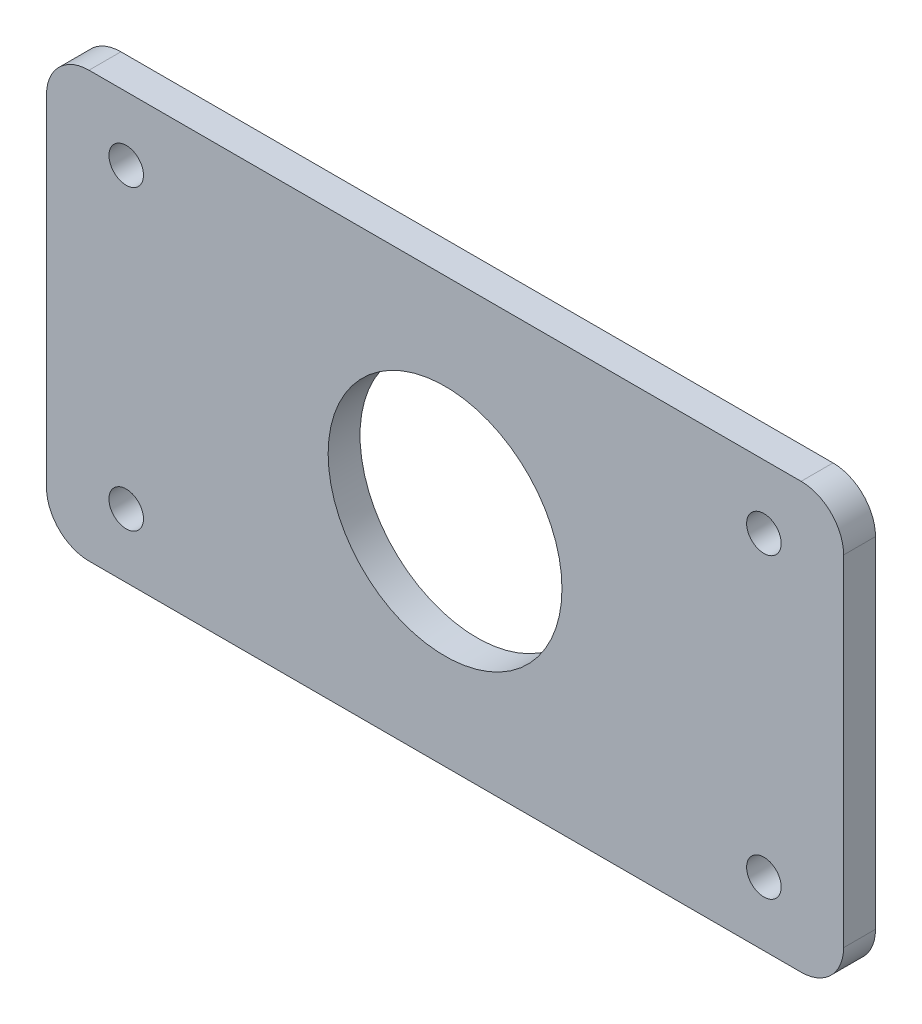
ISO-10303-21;
HEADER;
FILE_DESCRIPTION(('STEP AP214'),'2;1');
FILE_NAME('part.step','',(''),(''),'','','');
FILE_SCHEMA(('AUTOMOTIVE_DESIGN { 1 0 10303 214 1 1 1 1 }'));
ENDSEC;
DATA;
#1=APPLICATION_CONTEXT('core data for automotive mechanical design processes');
#2=APPLICATION_PROTOCOL_DEFINITION('international standard','automotive_design',2000,#1);
#3=PRODUCT_CONTEXT('',#1,'mechanical');
#4=PRODUCT('Part','Part','',(#3));
#5=PRODUCT_RELATED_PRODUCT_CATEGORY('part','',(#4));
#6=PRODUCT_DEFINITION_FORMATION('','',#4);
#7=PRODUCT_DEFINITION_CONTEXT('part definition',#1,'design');
#8=PRODUCT_DEFINITION('design','',#6,#7);
#9=PRODUCT_DEFINITION_SHAPE('','',#8);
#10=(LENGTH_UNIT() NAMED_UNIT(*) SI_UNIT(.MILLI.,.METRE.));
#11=(NAMED_UNIT(*) PLANE_ANGLE_UNIT() SI_UNIT($,.RADIAN.));
#12=(NAMED_UNIT(*) SI_UNIT($,.STERADIAN.) SOLID_ANGLE_UNIT());
#13=UNCERTAINTY_MEASURE_WITH_UNIT(LENGTH_MEASURE(1.E-05),#10,'distance_accuracy_value','');
#14=(GEOMETRIC_REPRESENTATION_CONTEXT(3) GLOBAL_UNCERTAINTY_ASSIGNED_CONTEXT((#13)) GLOBAL_UNIT_ASSIGNED_CONTEXT((#10,
#11,#12)) REPRESENTATION_CONTEXT('',''));
#15=CARTESIAN_POINT('',(0.,0.,0.));
#16=DIRECTION('',(0.,0.,1.));
#17=DIRECTION('',(1.,0.,0.));
#18=AXIS2_PLACEMENT_3D('',#15,#16,#17);
#19=CARTESIAN_POINT('',(75.,-40.,3.));
#20=DIRECTION('',(-1.,0.,0.));
#21=DIRECTION('',(0.,0.,1.));
#22=AXIS2_PLACEMENT_3D('',#19,#20,#21);
#23=PLANE('',#22);
#24=DIRECTION('',(0.,1.,0.));
#25=VECTOR('',#24,1.);
#26=CARTESIAN_POINT('',(75.,-40.,-3.));
#27=LINE('',#26,#25);
#28=CARTESIAN_POINT('',(75.,-32.,-3.));
#29=VERTEX_POINT('',#28);
#30=CARTESIAN_POINT('',(75.,32.,-3.));
#31=VERTEX_POINT('',#30);
#32=EDGE_CURVE('E129',#29,#31,#27,.T.);
#33=ORIENTED_EDGE('',*,*,#32,.T.);
#34=DIRECTION('',(0.,0.,-1.));
#35=VECTOR('',#34,1.);
#36=CARTESIAN_POINT('',(75.,32.,3.));
#37=LINE('',#36,#35);
#38=CARTESIAN_POINT('',(75.,32.,3.));
#39=VERTEX_POINT('',#38);
#40=EDGE_CURVE('E107',#31,#39,#37,.F.);
#41=ORIENTED_EDGE('',*,*,#40,.T.);
#42=DIRECTION('',(0.,1.,0.));
#43=VECTOR('',#42,1.);
#44=CARTESIAN_POINT('',(75.,-40.,3.));
#45=LINE('',#44,#43);
#46=CARTESIAN_POINT('',(75.,-32.,3.));
#47=VERTEX_POINT('',#46);
#48=EDGE_CURVE('E139',#47,#39,#45,.T.);
#49=ORIENTED_EDGE('',*,*,#48,.F.);
#50=DIRECTION('',(0.,0.,-1.));
#51=VECTOR('',#50,1.);
#52=CARTESIAN_POINT('',(75.,-32.,3.));
#53=LINE('',#52,#51);
#54=EDGE_CURVE('E112',#47,#29,#53,.T.);
#55=ORIENTED_EDGE('',*,*,#54,.T.);
#56=EDGE_LOOP('',(#33,#41,#49,#55));
#57=FACE_BOUND('',#56,.T.);
#58=ADVANCED_FACE('F36',(#57),#23,.F.);
#59=CARTESIAN_POINT('',(-75.,40.,3.));
#60=DIRECTION('',(0.,-1.,0.));
#61=DIRECTION('',(0.,0.,-1.));
#62=AXIS2_PLACEMENT_3D('',#59,#60,#61);
#63=PLANE('',#62);
#64=DIRECTION('',(-1.,0.,0.));
#65=VECTOR('',#64,1.);
#66=CARTESIAN_POINT('',(-75.,40.,3.));
#67=LINE('',#66,#65);
#68=CARTESIAN_POINT('',(67.,40.,3.));
#69=VERTEX_POINT('',#68);
#70=CARTESIAN_POINT('',(-67.,40.,3.));
#71=VERTEX_POINT('',#70);
#72=EDGE_CURVE('E122',#69,#71,#67,.T.);
#73=ORIENTED_EDGE('',*,*,#72,.F.);
#74=DIRECTION('',(0.,0.,-1.));
#75=VECTOR('',#74,1.);
#76=CARTESIAN_POINT('',(67.,40.,3.));
#77=LINE('',#76,#75);
#78=CARTESIAN_POINT('',(67.,40.,-3.));
#79=VERTEX_POINT('',#78);
#80=EDGE_CURVE('E106',#69,#79,#77,.T.);
#81=ORIENTED_EDGE('',*,*,#80,.T.);
#82=DIRECTION('',(-1.,0.,0.));
#83=VECTOR('',#82,1.);
#84=CARTESIAN_POINT('',(-75.,40.,-3.));
#85=LINE('',#84,#83);
#86=CARTESIAN_POINT('',(-67.,40.,-3.));
#87=VERTEX_POINT('',#86);
#88=EDGE_CURVE('E119',#79,#87,#85,.T.);
#89=ORIENTED_EDGE('',*,*,#88,.T.);
#90=DIRECTION('',(0.,0.,-1.));
#91=VECTOR('',#90,1.);
#92=CARTESIAN_POINT('',(-67.,40.,3.));
#93=LINE('',#92,#91);
#94=EDGE_CURVE('E124',#87,#71,#93,.F.);
#95=ORIENTED_EDGE('',*,*,#94,.T.);
#96=EDGE_LOOP('',(#73,#81,#89,#95));
#97=FACE_BOUND('',#96,.T.);
#98=ADVANCED_FACE('F118',(#97),#63,.F.);
#99=CARTESIAN_POINT('',(-75.,-40.,3.));
#100=DIRECTION('',(1.,0.,0.));
#101=DIRECTION('',(0.,0.,-1.));
#102=AXIS2_PLACEMENT_3D('',#99,#100,#101);
#103=PLANE('',#102);
#104=DIRECTION('',(0.,-1.,0.));
#105=VECTOR('',#104,1.);
#106=CARTESIAN_POINT('',(-75.,-40.,-3.));
#107=LINE('',#106,#105);
#108=CARTESIAN_POINT('',(-75.,32.,-3.));
#109=VERTEX_POINT('',#108);
#110=CARTESIAN_POINT('',(-75.,-32.,-3.));
#111=VERTEX_POINT('',#110);
#112=EDGE_CURVE('E128',#109,#111,#107,.T.);
#113=ORIENTED_EDGE('',*,*,#112,.T.);
#114=DIRECTION('',(0.,0.,-1.));
#115=VECTOR('',#114,1.);
#116=CARTESIAN_POINT('',(-75.,-32.,3.));
#117=LINE('',#116,#115);
#118=CARTESIAN_POINT('',(-75.,-32.,3.));
#119=VERTEX_POINT('',#118);
#120=EDGE_CURVE('E11',#111,#119,#117,.F.);
#121=ORIENTED_EDGE('',*,*,#120,.T.);
#122=DIRECTION('',(0.,-1.,0.));
#123=VECTOR('',#122,1.);
#124=CARTESIAN_POINT('',(-75.,-40.,3.));
#125=LINE('',#124,#123);
#126=CARTESIAN_POINT('',(-75.,32.,3.));
#127=VERTEX_POINT('',#126);
#128=EDGE_CURVE('E165',#127,#119,#125,.T.);
#129=ORIENTED_EDGE('',*,*,#128,.F.);
#130=DIRECTION('',(0.,0.,-1.));
#131=VECTOR('',#130,1.);
#132=CARTESIAN_POINT('',(-75.,32.,3.));
#133=LINE('',#132,#131);
#134=EDGE_CURVE('E44',#127,#109,#133,.T.);
#135=ORIENTED_EDGE('',*,*,#134,.T.);
#136=EDGE_LOOP('',(#113,#121,#129,#135));
#137=FACE_BOUND('',#136,.T.);
#138=ADVANCED_FACE('F163',(#137),#103,.F.);
#139=CARTESIAN_POINT('',(-75.,-40.,3.));
#140=DIRECTION('',(0.,1.,0.));
#141=DIRECTION('',(0.,0.,1.));
#142=AXIS2_PLACEMENT_3D('',#139,#140,#141);
#143=PLANE('',#142);
#144=DIRECTION('',(1.,0.,0.));
#145=VECTOR('',#144,1.);
#146=CARTESIAN_POINT('',(-75.,-40.,-3.));
#147=LINE('',#146,#145);
#148=CARTESIAN_POINT('',(-67.,-40.,-3.));
#149=VERTEX_POINT('',#148);
#150=CARTESIAN_POINT('',(67.,-40.,-3.));
#151=VERTEX_POINT('',#150);
#152=EDGE_CURVE('E132',#149,#151,#147,.T.);
#153=ORIENTED_EDGE('',*,*,#152,.T.);
#154=DIRECTION('',(0.,0.,-1.));
#155=VECTOR('',#154,1.);
#156=CARTESIAN_POINT('',(67.,-40.,3.));
#157=LINE('',#156,#155);
#158=CARTESIAN_POINT('',(67.,-40.,3.));
#159=VERTEX_POINT('',#158);
#160=EDGE_CURVE('E51',#151,#159,#157,.F.);
#161=ORIENTED_EDGE('',*,*,#160,.T.);
#162=DIRECTION('',(1.,0.,0.));
#163=VECTOR('',#162,1.);
#164=CARTESIAN_POINT('',(-75.,-40.,3.));
#165=LINE('',#164,#163);
#166=CARTESIAN_POINT('',(-67.,-40.,3.));
#167=VERTEX_POINT('',#166);
#168=EDGE_CURVE('E140',#167,#159,#165,.T.);
#169=ORIENTED_EDGE('',*,*,#168,.F.);
#170=DIRECTION('',(0.,0.,-1.));
#171=VECTOR('',#170,1.);
#172=CARTESIAN_POINT('',(-67.,-40.,3.));
#173=LINE('',#172,#171);
#174=EDGE_CURVE('E156',#167,#149,#173,.T.);
#175=ORIENTED_EDGE('',*,*,#174,.T.);
#176=EDGE_LOOP('',(#153,#161,#169,#175));
#177=FACE_BOUND('',#176,.T.);
#178=ADVANCED_FACE('F172',(#177),#143,.F.);
#179=CARTESIAN_POINT('',(0.,0.,3.));
#180=DIRECTION('',(0.,0.,-1.));
#181=DIRECTION('',(-1.,0.,0.));
#182=AXIS2_PLACEMENT_3D('',#179,#180,#181);
#183=PLANE('',#182);
#184=CARTESIAN_POINT('',(60.,28.,3.));
#185=DIRECTION('',(0.,0.,-1.));
#186=DIRECTION('',(-1.,0.,0.));
#187=AXIS2_PLACEMENT_3D('',#184,#185,#186);
#188=CIRCLE('',#187,3.25000000000001);
#189=CARTESIAN_POINT('',(56.75,28.,3.));
#190=VERTEX_POINT('',#189);
#191=EDGE_CURVE('E134',#190,#190,#188,.T.);
#192=ORIENTED_EDGE('',*,*,#191,.T.);
#193=EDGE_LOOP('',(#192));
#194=FACE_BOUND('',#193,.T.);
#195=CARTESIAN_POINT('',(60.,-28.,3.));
#196=DIRECTION('',(0.,0.,-1.));
#197=DIRECTION('',(-1.,0.,0.));
#198=AXIS2_PLACEMENT_3D('',#195,#196,#197);
#199=CIRCLE('',#198,3.25000000000001);
#200=CARTESIAN_POINT('',(56.75,-28.,3.));
#201=VERTEX_POINT('',#200);
#202=EDGE_CURVE('E181',#201,#201,#199,.T.);
#203=ORIENTED_EDGE('',*,*,#202,.T.);
#204=EDGE_LOOP('',(#203));
#205=FACE_BOUND('',#204,.T.);
#206=CARTESIAN_POINT('',(-60.,-28.,3.));
#207=DIRECTION('',(0.,0.,-1.));
#208=DIRECTION('',(-1.,0.,0.));
#209=AXIS2_PLACEMENT_3D('',#206,#207,#208);
#210=CIRCLE('',#209,3.25);
#211=CARTESIAN_POINT('',(-63.25,-28.,3.));
#212=VERTEX_POINT('',#211);
#213=EDGE_CURVE('E184',#212,#212,#210,.T.);
#214=ORIENTED_EDGE('',*,*,#213,.T.);
#215=EDGE_LOOP('',(#214));
#216=FACE_BOUND('',#215,.T.);
#217=CARTESIAN_POINT('',(-60.,28.,3.));
#218=DIRECTION('',(0.,0.,-1.));
#219=DIRECTION('',(-1.,0.,0.));
#220=AXIS2_PLACEMENT_3D('',#217,#218,#219);
#221=CIRCLE('',#220,3.25);
#222=CARTESIAN_POINT('',(-63.25,28.,3.));
#223=VERTEX_POINT('',#222);
#224=EDGE_CURVE('E187',#223,#223,#221,.T.);
#225=ORIENTED_EDGE('',*,*,#224,.T.);
#226=EDGE_LOOP('',(#225));
#227=FACE_BOUND('',#226,.T.);
#228=CARTESIAN_POINT('',(0.,0.,3.));
#229=DIRECTION('',(0.,0.,-1.));
#230=DIRECTION('',(-1.,0.,0.));
#231=AXIS2_PLACEMENT_3D('',#228,#229,#230);
#232=CIRCLE('',#231,22.);
#233=CARTESIAN_POINT('',(-22.,0.,3.));
#234=VERTEX_POINT('',#233);
#235=EDGE_CURVE('E190',#234,#234,#232,.T.);
#236=ORIENTED_EDGE('',*,*,#235,.T.);
#237=EDGE_LOOP('',(#236));
#238=FACE_BOUND('',#237,.T.);
#239=ORIENTED_EDGE('',*,*,#48,.T.);
#240=CARTESIAN_POINT('',(67.,32.,3.));
#241=DIRECTION('',(0.,0.,-1.));
#242=DIRECTION('',(-1.,0.,0.));
#243=AXIS2_PLACEMENT_3D('',#240,#241,#242);
#244=CIRCLE('',#243,8.);
#245=EDGE_CURVE('E154',#39,#69,#244,.F.);
#246=ORIENTED_EDGE('',*,*,#245,.T.);
#247=ORIENTED_EDGE('',*,*,#72,.T.);
#248=CARTESIAN_POINT('',(-67.,32.,3.));
#249=DIRECTION('',(0.,0.,-1.));
#250=DIRECTION('',(-1.,0.,0.));
#251=AXIS2_PLACEMENT_3D('',#248,#249,#250);
#252=CIRCLE('',#251,8.);
#253=EDGE_CURVE('E149',#71,#127,#252,.F.);
#254=ORIENTED_EDGE('',*,*,#253,.T.);
#255=ORIENTED_EDGE('',*,*,#128,.T.);
#256=CARTESIAN_POINT('',(-67.,-32.,3.));
#257=DIRECTION('',(0.,0.,-1.));
#258=DIRECTION('',(-1.,0.,0.));
#259=AXIS2_PLACEMENT_3D('',#256,#257,#258);
#260=CIRCLE('',#259,8.);
#261=EDGE_CURVE('E58',#119,#167,#260,.F.);
#262=ORIENTED_EDGE('',*,*,#261,.T.);
#263=ORIENTED_EDGE('',*,*,#168,.T.);
#264=CARTESIAN_POINT('',(67.,-32.,3.));
#265=DIRECTION('',(0.,0.,-1.));
#266=DIRECTION('',(-1.,0.,0.));
#267=AXIS2_PLACEMENT_3D('',#264,#265,#266);
#268=CIRCLE('',#267,8.);
#269=EDGE_CURVE('E152',#159,#47,#268,.F.);
#270=ORIENTED_EDGE('',*,*,#269,.T.);
#271=EDGE_LOOP('',(#239,#246,#247,#254,#255,#262,#263,#270));
#272=FACE_BOUND('',#271,.T.);
#273=ADVANCED_FACE('F219',(#194,#205,#216,#227,#238,#272),#183,.F.);
#274=CARTESIAN_POINT('',(0.,0.,-3.));
#275=DIRECTION('',(0.,0.,-1.));
#276=DIRECTION('',(-1.,0.,0.));
#277=AXIS2_PLACEMENT_3D('',#274,#275,#276);
#278=PLANE('',#277);
#279=CARTESIAN_POINT('',(60.,28.,-3.));
#280=DIRECTION('',(0.,0.,1.));
#281=DIRECTION('',(1.,0.,0.));
#282=AXIS2_PLACEMENT_3D('',#279,#280,#281);
#283=CIRCLE('',#282,3.25000000000001);
#284=CARTESIAN_POINT('',(63.25,28.,-3.));
#285=VERTEX_POINT('',#284);
#286=EDGE_CURVE('E197',#285,#285,#283,.T.);
#287=ORIENTED_EDGE('',*,*,#286,.T.);
#288=EDGE_LOOP('',(#287));
#289=FACE_BOUND('',#288,.T.);
#290=CARTESIAN_POINT('',(60.,-28.,-3.));
#291=DIRECTION('',(0.,0.,1.));
#292=DIRECTION('',(1.,0.,0.));
#293=AXIS2_PLACEMENT_3D('',#290,#291,#292);
#294=CIRCLE('',#293,3.25000000000001);
#295=CARTESIAN_POINT('',(63.25,-28.,-3.));
#296=VERTEX_POINT('',#295);
#297=EDGE_CURVE('E200',#296,#296,#294,.T.);
#298=ORIENTED_EDGE('',*,*,#297,.T.);
#299=EDGE_LOOP('',(#298));
#300=FACE_BOUND('',#299,.T.);
#301=CARTESIAN_POINT('',(-60.,-28.,-3.));
#302=DIRECTION('',(0.,0.,1.));
#303=DIRECTION('',(1.,0.,0.));
#304=AXIS2_PLACEMENT_3D('',#301,#302,#303);
#305=CIRCLE('',#304,3.25);
#306=CARTESIAN_POINT('',(-56.75,-28.,-3.));
#307=VERTEX_POINT('',#306);
#308=EDGE_CURVE('E203',#307,#307,#305,.T.);
#309=ORIENTED_EDGE('',*,*,#308,.T.);
#310=EDGE_LOOP('',(#309));
#311=FACE_BOUND('',#310,.T.);
#312=CARTESIAN_POINT('',(-60.,28.,-3.));
#313=DIRECTION('',(0.,0.,1.));
#314=DIRECTION('',(1.,0.,0.));
#315=AXIS2_PLACEMENT_3D('',#312,#313,#314);
#316=CIRCLE('',#315,3.25);
#317=CARTESIAN_POINT('',(-56.75,28.,-3.));
#318=VERTEX_POINT('',#317);
#319=EDGE_CURVE('E196',#318,#318,#316,.T.);
#320=ORIENTED_EDGE('',*,*,#319,.T.);
#321=EDGE_LOOP('',(#320));
#322=FACE_BOUND('',#321,.T.);
#323=CARTESIAN_POINT('',(0.,0.,-3.));
#324=DIRECTION('',(0.,0.,1.));
#325=DIRECTION('',(1.,0.,0.));
#326=AXIS2_PLACEMENT_3D('',#323,#324,#325);
#327=CIRCLE('',#326,22.);
#328=CARTESIAN_POINT('',(22.,0.,-3.));
#329=VERTEX_POINT('',#328);
#330=EDGE_CURVE('E193',#329,#329,#327,.T.);
#331=ORIENTED_EDGE('',*,*,#330,.T.);
#332=EDGE_LOOP('',(#331));
#333=FACE_BOUND('',#332,.T.);
#334=ORIENTED_EDGE('',*,*,#88,.F.);
#335=CARTESIAN_POINT('',(67.,32.,-3.));
#336=DIRECTION('',(0.,0.,-1.));
#337=DIRECTION('',(-1.,0.,0.));
#338=AXIS2_PLACEMENT_3D('',#335,#336,#337);
#339=CIRCLE('',#338,8.);
#340=EDGE_CURVE('E102',#79,#31,#339,.T.);
#341=ORIENTED_EDGE('',*,*,#340,.T.);
#342=ORIENTED_EDGE('',*,*,#32,.F.);
#343=CARTESIAN_POINT('',(67.,-32.,-3.));
#344=DIRECTION('',(0.,0.,-1.));
#345=DIRECTION('',(-1.,0.,0.));
#346=AXIS2_PLACEMENT_3D('',#343,#344,#345);
#347=CIRCLE('',#346,8.);
#348=EDGE_CURVE('E113',#29,#151,#347,.T.);
#349=ORIENTED_EDGE('',*,*,#348,.T.);
#350=ORIENTED_EDGE('',*,*,#152,.F.);
#351=CARTESIAN_POINT('',(-67.,-32.,-3.));
#352=DIRECTION('',(0.,0.,-1.));
#353=DIRECTION('',(-1.,0.,0.));
#354=AXIS2_PLACEMENT_3D('',#351,#352,#353);
#355=CIRCLE('',#354,8.);
#356=EDGE_CURVE('E143',#149,#111,#355,.T.);
#357=ORIENTED_EDGE('',*,*,#356,.T.);
#358=ORIENTED_EDGE('',*,*,#112,.F.);
#359=CARTESIAN_POINT('',(-67.,32.,-3.));
#360=DIRECTION('',(0.,0.,-1.));
#361=DIRECTION('',(-1.,0.,0.));
#362=AXIS2_PLACEMENT_3D('',#359,#360,#361);
#363=CIRCLE('',#362,8.);
#364=EDGE_CURVE('E123',#109,#87,#363,.T.);
#365=ORIENTED_EDGE('',*,*,#364,.T.);
#366=EDGE_LOOP('',(#334,#341,#342,#349,#350,#357,#358,#365));
#367=FACE_BOUND('',#366,.T.);
#368=ADVANCED_FACE('F126',(#289,#300,#311,#322,#333,#367),#278,.T.);
#369=CARTESIAN_POINT('',(0.,0.,-3.));
#370=DIRECTION('',(0.,0.,1.));
#371=DIRECTION('',(1.,0.,0.));
#372=AXIS2_PLACEMENT_3D('',#369,#370,#371);
#373=CYLINDRICAL_SURFACE('',#372,22.);
#374=ORIENTED_EDGE('',*,*,#330,.F.);
#375=EDGE_LOOP('',(#374));
#376=FACE_BOUND('',#375,.T.);
#377=ORIENTED_EDGE('',*,*,#235,.F.);
#378=EDGE_LOOP('',(#377));
#379=FACE_BOUND('',#378,.T.);
#380=ADVANCED_FACE('F215',(#376,#379),#373,.F.);
#381=CARTESIAN_POINT('',(-60.,28.,-3.));
#382=DIRECTION('',(0.,0.,1.));
#383=DIRECTION('',(1.,0.,0.));
#384=AXIS2_PLACEMENT_3D('',#381,#382,#383);
#385=CYLINDRICAL_SURFACE('',#384,3.25);
#386=ORIENTED_EDGE('',*,*,#319,.F.);
#387=EDGE_LOOP('',(#386));
#388=FACE_BOUND('',#387,.T.);
#389=ORIENTED_EDGE('',*,*,#224,.F.);
#390=EDGE_LOOP('',(#389));
#391=FACE_BOUND('',#390,.T.);
#392=ADVANCED_FACE('F211',(#388,#391),#385,.F.);
#393=CARTESIAN_POINT('',(-60.,-28.,-3.));
#394=DIRECTION('',(0.,0.,1.));
#395=DIRECTION('',(1.,0.,0.));
#396=AXIS2_PLACEMENT_3D('',#393,#394,#395);
#397=CYLINDRICAL_SURFACE('',#396,3.25);
#398=ORIENTED_EDGE('',*,*,#308,.F.);
#399=EDGE_LOOP('',(#398));
#400=FACE_BOUND('',#399,.T.);
#401=ORIENTED_EDGE('',*,*,#213,.F.);
#402=EDGE_LOOP('',(#401));
#403=FACE_BOUND('',#402,.T.);
#404=ADVANCED_FACE('F214',(#400,#403),#397,.F.);
#405=CARTESIAN_POINT('',(60.,-28.,-3.));
#406=DIRECTION('',(0.,0.,1.));
#407=DIRECTION('',(1.,0.,0.));
#408=AXIS2_PLACEMENT_3D('',#405,#406,#407);
#409=CYLINDRICAL_SURFACE('',#408,3.25000000000001);
#410=ORIENTED_EDGE('',*,*,#297,.F.);
#411=EDGE_LOOP('',(#410));
#412=FACE_BOUND('',#411,.T.);
#413=ORIENTED_EDGE('',*,*,#202,.F.);
#414=EDGE_LOOP('',(#413));
#415=FACE_BOUND('',#414,.T.);
#416=ADVANCED_FACE('F257',(#412,#415),#409,.F.);
#417=CARTESIAN_POINT('',(60.,28.,-3.));
#418=DIRECTION('',(0.,0.,1.));
#419=DIRECTION('',(1.,0.,0.));
#420=AXIS2_PLACEMENT_3D('',#417,#418,#419);
#421=CYLINDRICAL_SURFACE('',#420,3.25000000000001);
#422=ORIENTED_EDGE('',*,*,#286,.F.);
#423=EDGE_LOOP('',(#422));
#424=FACE_BOUND('',#423,.T.);
#425=ORIENTED_EDGE('',*,*,#191,.F.);
#426=EDGE_LOOP('',(#425));
#427=FACE_BOUND('',#426,.T.);
#428=ADVANCED_FACE('F236',(#424,#427),#421,.F.);
#429=CARTESIAN_POINT('',(67.,32.,3.));
#430=DIRECTION('',(0.,0.,-1.));
#431=DIRECTION('',(-1.,0.,0.));
#432=AXIS2_PLACEMENT_3D('',#429,#430,#431);
#433=CYLINDRICAL_SURFACE('',#432,8.);
#434=ORIENTED_EDGE('',*,*,#245,.F.);
#435=ORIENTED_EDGE('',*,*,#40,.F.);
#436=ORIENTED_EDGE('',*,*,#340,.F.);
#437=ORIENTED_EDGE('',*,*,#80,.F.);
#438=EDGE_LOOP('',(#434,#435,#436,#437));
#439=FACE_BOUND('',#438,.T.);
#440=ADVANCED_FACE('F105',(#439),#433,.T.);
#441=CARTESIAN_POINT('',(67.,-32.,3.));
#442=DIRECTION('',(0.,0.,-1.));
#443=DIRECTION('',(-1.,0.,0.));
#444=AXIS2_PLACEMENT_3D('',#441,#442,#443);
#445=CYLINDRICAL_SURFACE('',#444,8.);
#446=ORIENTED_EDGE('',*,*,#269,.F.);
#447=ORIENTED_EDGE('',*,*,#160,.F.);
#448=ORIENTED_EDGE('',*,*,#348,.F.);
#449=ORIENTED_EDGE('',*,*,#54,.F.);
#450=EDGE_LOOP('',(#446,#447,#448,#449));
#451=FACE_BOUND('',#450,.T.);
#452=ADVANCED_FACE('F229',(#451),#445,.T.);
#453=CARTESIAN_POINT('',(-67.,-32.,3.));
#454=DIRECTION('',(0.,0.,-1.));
#455=DIRECTION('',(-1.,0.,0.));
#456=AXIS2_PLACEMENT_3D('',#453,#454,#455);
#457=CYLINDRICAL_SURFACE('',#456,8.);
#458=ORIENTED_EDGE('',*,*,#261,.F.);
#459=ORIENTED_EDGE('',*,*,#120,.F.);
#460=ORIENTED_EDGE('',*,*,#356,.F.);
#461=ORIENTED_EDGE('',*,*,#174,.F.);
#462=EDGE_LOOP('',(#458,#459,#460,#461));
#463=FACE_BOUND('',#462,.T.);
#464=ADVANCED_FACE('F171',(#463),#457,.T.);
#465=CARTESIAN_POINT('',(-67.,32.,3.));
#466=DIRECTION('',(0.,0.,-1.));
#467=DIRECTION('',(-1.,0.,0.));
#468=AXIS2_PLACEMENT_3D('',#465,#466,#467);
#469=CYLINDRICAL_SURFACE('',#468,8.);
#470=ORIENTED_EDGE('',*,*,#253,.F.);
#471=ORIENTED_EDGE('',*,*,#94,.F.);
#472=ORIENTED_EDGE('',*,*,#364,.F.);
#473=ORIENTED_EDGE('',*,*,#134,.F.);
#474=EDGE_LOOP('',(#470,#471,#472,#473));
#475=FACE_BOUND('',#474,.T.);
#476=ADVANCED_FACE('F38',(#475),#469,.T.);
#477=CLOSED_SHELL('',(#58,#98,#138,#178,#273,#368,#380,#392,#404,#416,#428,#440,#452,#464,#476));
#478=MANIFOLD_SOLID_BREP('B2',#477);
#479=ADVANCED_BREP_SHAPE_REPRESENTATION('',(#18,#478),#14);
#480=SHAPE_DEFINITION_REPRESENTATION(#9,#479);
ENDSEC;
END-ISO-10303-21;
